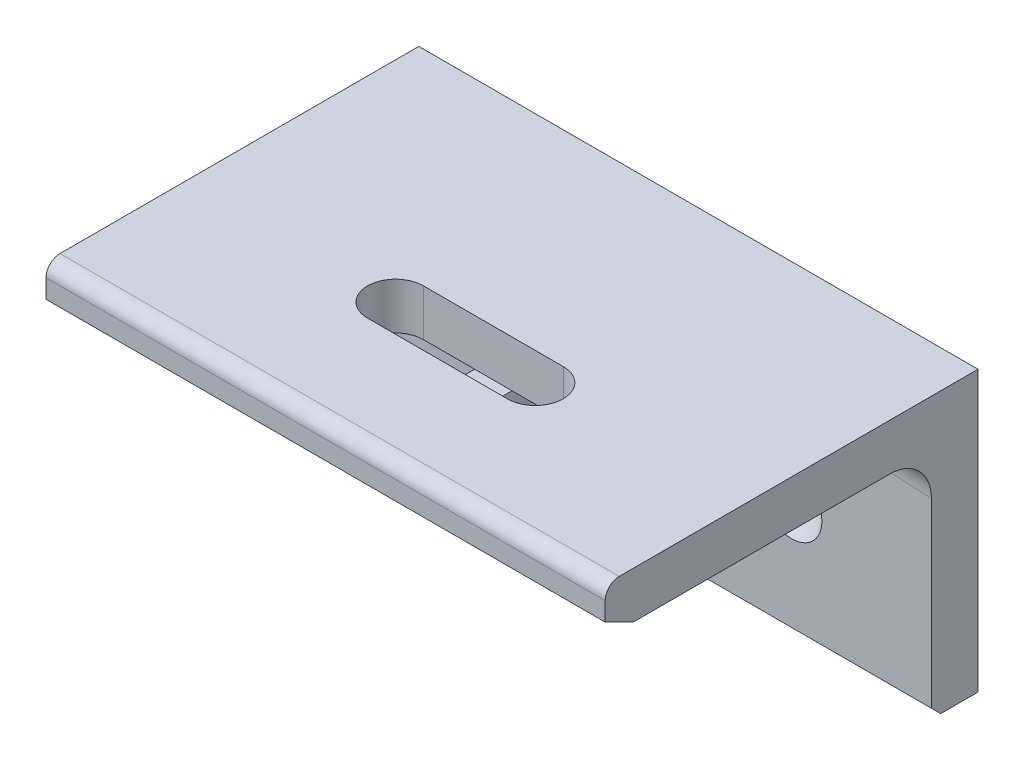
ISO-10303-21;
HEADER;
FILE_DESCRIPTION(('STEP AP214'),'2;1');
FILE_NAME('part.step','',(''),(''),'','','');
FILE_SCHEMA(('AUTOMOTIVE_DESIGN { 1 0 10303 214 1 1 1 1 }'));
ENDSEC;
DATA;
#1=APPLICATION_CONTEXT('core data for automotive mechanical design processes');
#2=APPLICATION_PROTOCOL_DEFINITION('international standard','automotive_design',2000,#1);
#3=PRODUCT_CONTEXT('',#1,'mechanical');
#4=PRODUCT('Part','Part','',(#3));
#5=PRODUCT_RELATED_PRODUCT_CATEGORY('part','',(#4));
#6=PRODUCT_DEFINITION_FORMATION('','',#4);
#7=PRODUCT_DEFINITION_CONTEXT('part definition',#1,'design');
#8=PRODUCT_DEFINITION('design','',#6,#7);
#9=PRODUCT_DEFINITION_SHAPE('','',#8);
#10=(LENGTH_UNIT() NAMED_UNIT(*) SI_UNIT(.MILLI.,.METRE.));
#11=(NAMED_UNIT(*) PLANE_ANGLE_UNIT() SI_UNIT($,.RADIAN.));
#12=(NAMED_UNIT(*) SI_UNIT($,.STERADIAN.) SOLID_ANGLE_UNIT());
#13=UNCERTAINTY_MEASURE_WITH_UNIT(LENGTH_MEASURE(1.E-05),#10,'distance_accuracy_value','');
#14=(GEOMETRIC_REPRESENTATION_CONTEXT(3) GLOBAL_UNCERTAINTY_ASSIGNED_CONTEXT((#13)) GLOBAL_UNIT_ASSIGNED_CONTEXT((#10,
#11,#12)) REPRESENTATION_CONTEXT('',''));
#15=CARTESIAN_POINT('',(0.,0.,0.));
#16=DIRECTION('',(0.,0.,1.));
#17=DIRECTION('',(1.,0.,0.));
#18=AXIS2_PLACEMENT_3D('',#15,#16,#17);
#19=CARTESIAN_POINT('',(120.,50.,10.));
#20=DIRECTION('',(0.,1.,0.));
#21=DIRECTION('',(0.,0.,1.));
#22=AXIS2_PLACEMENT_3D('',#19,#20,#21);
#23=PLANE('',#22);
#24=DIRECTION('',(1.,0.,0.));
#25=VECTOR('',#24,1.);
#26=CARTESIAN_POINT('',(75.,50.,56.));
#27=LINE('',#26,#25);
#28=CARTESIAN_POINT('',(45.,50.,56.));
#29=VERTEX_POINT('',#28);
#30=CARTESIAN_POINT('',(56.,50.,56.));
#31=VERTEX_POINT('',#30);
#32=EDGE_CURVE('E228',#29,#31,#27,.T.);
#33=ORIENTED_EDGE('',*,*,#32,.T.);
#34=DIRECTION('',(0.,0.,1.));
#35=VECTOR('',#34,1.);
#36=CARTESIAN_POINT('',(56.,50.,60.));
#37=LINE('',#36,#35);
#38=CARTESIAN_POINT('',(56.,50.,60.));
#39=VERTEX_POINT('',#38);
#40=EDGE_CURVE('E310',#31,#39,#37,.T.);
#41=ORIENTED_EDGE('',*,*,#40,.T.);
#42=DIRECTION('',(-1.,0.,0.));
#43=VECTOR('',#42,1.);
#44=CARTESIAN_POINT('',(64.,50.,60.));
#45=LINE('',#44,#43);
#46=CARTESIAN_POINT('',(64.,50.,60.));
#47=VERTEX_POINT('',#46);
#48=EDGE_CURVE('E340',#47,#39,#45,.T.);
#49=ORIENTED_EDGE('',*,*,#48,.F.);
#50=DIRECTION('',(0.,0.,1.));
#51=VECTOR('',#50,1.);
#52=CARTESIAN_POINT('',(64.,50.,60.));
#53=LINE('',#52,#51);
#54=CARTESIAN_POINT('',(64.,50.,56.));
#55=VERTEX_POINT('',#54);
#56=EDGE_CURVE('E316',#55,#47,#53,.T.);
#57=ORIENTED_EDGE('',*,*,#56,.F.);
#58=CARTESIAN_POINT('',(75.,50.,56.));
#59=VERTEX_POINT('',#58);
#60=EDGE_CURVE('E249',#55,#59,#27,.T.);
#61=ORIENTED_EDGE('',*,*,#60,.T.);
#62=CARTESIAN_POINT('',(75.,50.,50.));
#63=DIRECTION('',(0.,1.,0.));
#64=DIRECTION('',(0.,0.,-1.));
#65=AXIS2_PLACEMENT_3D('',#62,#63,#64);
#66=CIRCLE('',#65,6.);
#67=CARTESIAN_POINT('',(75.,50.,44.));
#68=VERTEX_POINT('',#67);
#69=EDGE_CURVE('E252',#59,#68,#66,.T.);
#70=ORIENTED_EDGE('',*,*,#69,.T.);
#71=DIRECTION('',(-1.,0.,0.));
#72=VECTOR('',#71,1.);
#73=CARTESIAN_POINT('',(45.,50.,44.));
#74=LINE('',#73,#72);
#75=CARTESIAN_POINT('',(64.,50.,44.));
#76=VERTEX_POINT('',#75);
#77=EDGE_CURVE('E222',#68,#76,#74,.T.);
#78=ORIENTED_EDGE('',*,*,#77,.T.);
#79=CARTESIAN_POINT('',(64.,50.,16.2));
#80=VERTEX_POINT('',#79);
#81=EDGE_CURVE('E311',#80,#76,#53,.T.);
#82=ORIENTED_EDGE('',*,*,#81,.F.);
#83=DIRECTION('',(0.998752338877845,0.,0.0499376169438924));
#84=VECTOR('',#83,1.);
#85=CARTESIAN_POINT('',(59.9999999512245,50.,15.9999999975612));
#86=LINE('',#85,#84);
#87=CARTESIAN_POINT('',(120.,50.,19.));
#88=VERTEX_POINT('',#87);
#89=EDGE_CURVE('E350',#80,#88,#86,.T.);
#90=ORIENTED_EDGE('',*,*,#89,.T.);
#91=DIRECTION('',(0.,0.,-1.));
#92=VECTOR('',#91,1.);
#93=CARTESIAN_POINT('',(120.,50.,10.));
#94=LINE('',#93,#92);
#95=CARTESIAN_POINT('',(120.,50.,74.));
#96=VERTEX_POINT('',#95);
#97=EDGE_CURVE('E489',#96,#88,#94,.T.);
#98=ORIENTED_EDGE('',*,*,#97,.F.);
#99=DIRECTION('',(-1.,0.,0.));
#100=VECTOR('',#99,1.);
#101=CARTESIAN_POINT('',(120.,50.,74.));
#102=LINE('',#101,#100);
#103=CARTESIAN_POINT('',(0.,50.,74.));
#104=VERTEX_POINT('',#103);
#105=EDGE_CURVE('E306',#96,#104,#102,.T.);
#106=ORIENTED_EDGE('',*,*,#105,.T.);
#107=DIRECTION('',(0.,0.,-1.));
#108=VECTOR('',#107,1.);
#109=CARTESIAN_POINT('',(0.,50.,10.));
#110=LINE('',#109,#108);
#111=CARTESIAN_POINT('',(0.,50.,13.));
#112=VERTEX_POINT('',#111);
#113=EDGE_CURVE('E509',#104,#112,#110,.T.);
#114=ORIENTED_EDGE('',*,*,#113,.T.);
#115=CARTESIAN_POINT('',(56.,50.,15.8));
#116=VERTEX_POINT('',#115);
#117=EDGE_CURVE('E345',#112,#116,#86,.T.);
#118=ORIENTED_EDGE('',*,*,#117,.T.);
#119=CARTESIAN_POINT('',(56.,50.,44.));
#120=VERTEX_POINT('',#119);
#121=EDGE_CURVE('E325',#116,#120,#37,.T.);
#122=ORIENTED_EDGE('',*,*,#121,.T.);
#123=CARTESIAN_POINT('',(45.,50.,44.));
#124=VERTEX_POINT('',#123);
#125=EDGE_CURVE('E256',#120,#124,#74,.T.);
#126=ORIENTED_EDGE('',*,*,#125,.T.);
#127=CARTESIAN_POINT('',(45.,50.,50.));
#128=DIRECTION('',(0.,1.,0.));
#129=DIRECTION('',(0.,0.,-1.));
#130=AXIS2_PLACEMENT_3D('',#127,#128,#129);
#131=CIRCLE('',#130,6.);
#132=EDGE_CURVE('E246',#124,#29,#131,.T.);
#133=ORIENTED_EDGE('',*,*,#132,.T.);
#134=EDGE_LOOP('',(#33,#41,#49,#57,#61,#70,#78,#82,#90,#98,#106,#114,#118,#122,#126,#133));
#135=FACE_BOUND('',#134,.T.);
#136=ADVANCED_FACE('F71',(#135),#23,.F.);
#137=CARTESIAN_POINT('',(120.,60.,80.));
#138=DIRECTION('',(0.,-1.,0.));
#139=DIRECTION('',(0.,0.,-1.));
#140=AXIS2_PLACEMENT_3D('',#137,#138,#139);
#141=PLANE('',#140);
#142=DIRECTION('',(0.,0.,1.));
#143=VECTOR('',#142,1.);
#144=CARTESIAN_POINT('',(0.,60.,80.));
#145=LINE('',#144,#143);
#146=CARTESIAN_POINT('',(0.,60.,0.));
#147=VERTEX_POINT('',#146);
#148=CARTESIAN_POINT('',(0.,60.,77.));
#149=VERTEX_POINT('',#148);
#150=EDGE_CURVE('E533',#147,#149,#145,.T.);
#151=ORIENTED_EDGE('',*,*,#150,.T.);
#152=DIRECTION('',(-1.,0.,0.));
#153=VECTOR('',#152,1.);
#154=CARTESIAN_POINT('',(120.,60.,77.));
#155=LINE('',#154,#153);
#156=CARTESIAN_POINT('',(120.,60.,77.));
#157=VERTEX_POINT('',#156);
#158=EDGE_CURVE('E452',#149,#157,#155,.F.);
#159=ORIENTED_EDGE('',*,*,#158,.T.);
#160=DIRECTION('',(0.,0.,1.));
#161=VECTOR('',#160,1.);
#162=CARTESIAN_POINT('',(120.,60.,80.));
#163=LINE('',#162,#161);
#164=CARTESIAN_POINT('',(120.,60.,0.));
#165=VERTEX_POINT('',#164);
#166=EDGE_CURVE('E506',#165,#157,#163,.T.);
#167=ORIENTED_EDGE('',*,*,#166,.F.);
#168=DIRECTION('',(-1.,0.,0.));
#169=VECTOR('',#168,1.);
#170=CARTESIAN_POINT('',(120.,60.,0.));
#171=LINE('',#170,#169);
#172=EDGE_CURVE('E375',#165,#147,#171,.T.);
#173=ORIENTED_EDGE('',*,*,#172,.T.);
#174=EDGE_LOOP('',(#151,#159,#167,#173));
#175=FACE_BOUND('',#174,.T.);
#176=CARTESIAN_POINT('',(45.,60.,50.));
#177=DIRECTION('',(0.,1.,0.));
#178=DIRECTION('',(0.,0.,-1.));
#179=AXIS2_PLACEMENT_3D('',#176,#177,#178);
#180=CIRCLE('',#179,6.);
#181=CARTESIAN_POINT('',(45.,60.,44.));
#182=VERTEX_POINT('',#181);
#183=CARTESIAN_POINT('',(45.,60.,56.));
#184=VERTEX_POINT('',#183);
#185=EDGE_CURVE('E210',#182,#184,#180,.T.);
#186=ORIENTED_EDGE('',*,*,#185,.F.);
#187=DIRECTION('',(-1.,0.,0.));
#188=VECTOR('',#187,1.);
#189=CARTESIAN_POINT('',(45.,60.,44.));
#190=LINE('',#189,#188);
#191=CARTESIAN_POINT('',(75.,60.,44.));
#192=VERTEX_POINT('',#191);
#193=EDGE_CURVE('E241',#192,#182,#190,.T.);
#194=ORIENTED_EDGE('',*,*,#193,.F.);
#195=CARTESIAN_POINT('',(75.,60.,50.));
#196=DIRECTION('',(0.,1.,0.));
#197=DIRECTION('',(0.,0.,-1.));
#198=AXIS2_PLACEMENT_3D('',#195,#196,#197);
#199=CIRCLE('',#198,6.);
#200=CARTESIAN_POINT('',(75.,60.,56.));
#201=VERTEX_POINT('',#200);
#202=EDGE_CURVE('E235',#201,#192,#199,.T.);
#203=ORIENTED_EDGE('',*,*,#202,.F.);
#204=DIRECTION('',(1.,0.,0.));
#205=VECTOR('',#204,1.);
#206=CARTESIAN_POINT('',(75.,60.,56.));
#207=LINE('',#206,#205);
#208=EDGE_CURVE('E221',#184,#201,#207,.T.);
#209=ORIENTED_EDGE('',*,*,#208,.F.);
#210=EDGE_LOOP('',(#186,#194,#203,#209));
#211=FACE_BOUND('',#210,.T.);
#212=ADVANCED_FACE('F234',(#175,#211),#141,.F.);
#213=CARTESIAN_POINT('',(120.,50.,80.));
#214=DIRECTION('',(0.,0.,-1.));
#215=DIRECTION('',(-1.,0.,0.));
#216=AXIS2_PLACEMENT_3D('',#213,#214,#215);
#217=PLANE('',#216);
#218=DIRECTION('',(0.,-1.,0.));
#219=VECTOR('',#218,1.);
#220=CARTESIAN_POINT('',(120.,50.,80.));
#221=LINE('',#220,#219);
#222=CARTESIAN_POINT('',(120.,57.,80.));
#223=VERTEX_POINT('',#222);
#224=CARTESIAN_POINT('',(120.,53.,80.));
#225=VERTEX_POINT('',#224);
#226=EDGE_CURVE('E543',#223,#225,#221,.T.);
#227=ORIENTED_EDGE('',*,*,#226,.F.);
#228=DIRECTION('',(-1.,0.,0.));
#229=VECTOR('',#228,1.);
#230=CARTESIAN_POINT('',(120.,57.,80.));
#231=LINE('',#230,#229);
#232=CARTESIAN_POINT('',(0.,57.,80.));
#233=VERTEX_POINT('',#232);
#234=EDGE_CURVE('E454',#223,#233,#231,.T.);
#235=ORIENTED_EDGE('',*,*,#234,.T.);
#236=DIRECTION('',(0.,-1.,0.));
#237=VECTOR('',#236,1.);
#238=CARTESIAN_POINT('',(0.,50.,80.));
#239=LINE('',#238,#237);
#240=CARTESIAN_POINT('',(0.,53.,80.));
#241=VERTEX_POINT('',#240);
#242=EDGE_CURVE('E537',#233,#241,#239,.T.);
#243=ORIENTED_EDGE('',*,*,#242,.T.);
#244=DIRECTION('',(-1.,0.,0.));
#245=VECTOR('',#244,1.);
#246=CARTESIAN_POINT('',(120.,53.,80.));
#247=LINE('',#246,#245);
#248=EDGE_CURVE('E299',#225,#241,#247,.T.);
#249=ORIENTED_EDGE('',*,*,#248,.F.);
#250=EDGE_LOOP('',(#227,#235,#243,#249));
#251=FACE_BOUND('',#250,.T.);
#252=ADVANCED_FACE('F417',(#251),#217,.F.);
#253=CARTESIAN_POINT('',(120.,0.,0.));
#254=DIRECTION('',(-1.,0.,0.));
#255=DIRECTION('',(0.,0.,1.));
#256=AXIS2_PLACEMENT_3D('',#253,#254,#255);
#257=PLANE('',#256);
#258=DIRECTION('',(0.,-1.,0.));
#259=VECTOR('',#258,1.);
#260=CARTESIAN_POINT('',(120.,0.,10.));
#261=LINE('',#260,#259);
#262=CARTESIAN_POINT('',(120.,41.,10.));
#263=VERTEX_POINT('',#262);
#264=CARTESIAN_POINT('',(120.,1.99999999999999,10.));
#265=VERTEX_POINT('',#264);
#266=EDGE_CURVE('E478',#263,#265,#261,.T.);
#267=ORIENTED_EDGE('',*,*,#266,.T.);
#268=DIRECTION('',(0.,0.707106781186548,0.707106781186548));
#269=VECTOR('',#268,1.);
#270=CARTESIAN_POINT('',(120.,0.,8.00000000000001));
#271=LINE('',#270,#269);
#272=CARTESIAN_POINT('',(120.,0.,8.00000000000001));
#273=VERTEX_POINT('',#272);
#274=EDGE_CURVE('E12',#265,#273,#271,.F.);
#275=ORIENTED_EDGE('',*,*,#274,.T.);
#276=DIRECTION('',(0.,0.,-1.));
#277=VECTOR('',#276,1.);
#278=CARTESIAN_POINT('',(120.,0.,0.));
#279=LINE('',#278,#277);
#280=CARTESIAN_POINT('',(120.,0.,0.));
#281=VERTEX_POINT('',#280);
#282=EDGE_CURVE('E488',#273,#281,#279,.T.);
#283=ORIENTED_EDGE('',*,*,#282,.T.);
#284=DIRECTION('',(0.,1.,0.));
#285=VECTOR('',#284,1.);
#286=CARTESIAN_POINT('',(120.,60.,0.));
#287=LINE('',#286,#285);
#288=EDGE_CURVE('E503',#281,#165,#287,.T.);
#289=ORIENTED_EDGE('',*,*,#288,.T.);
#290=ORIENTED_EDGE('',*,*,#166,.T.);
#291=CARTESIAN_POINT('',(120.,57.,77.));
#292=DIRECTION('',(-1.,0.,0.));
#293=DIRECTION('',(0.,0.,1.));
#294=AXIS2_PLACEMENT_3D('',#291,#292,#293);
#295=CIRCLE('',#294,3.);
#296=EDGE_CURVE('E451',#157,#223,#295,.F.);
#297=ORIENTED_EDGE('',*,*,#296,.T.);
#298=ORIENTED_EDGE('',*,*,#226,.T.);
#299=DIRECTION('',(0.,0.447213595499957,0.894427190999916));
#300=VECTOR('',#299,1.);
#301=CARTESIAN_POINT('',(120.,53.,80.));
#302=LINE('',#301,#300);
#303=EDGE_CURVE('E295',#96,#225,#302,.T.);
#304=ORIENTED_EDGE('',*,*,#303,.F.);
#305=ORIENTED_EDGE('',*,*,#97,.T.);
#306=CARTESIAN_POINT('',(120.,41.0004744407489,18.9995255592511));
#307=DIRECTION('',(-1.,0.,0.));
#308=DIRECTION('',(0.,0.,1.));
#309=AXIS2_PLACEMENT_3D('',#306,#307,#308);
#310=CIRCLE('',#309,8.999525571757);
#311=EDGE_CURVE('E349',#88,#263,#310,.T.);
#312=ORIENTED_EDGE('',*,*,#311,.T.);
#313=EDGE_LOOP('',(#267,#275,#283,#289,#290,#297,#298,#304,#305,#312));
#314=FACE_BOUND('',#313,.T.);
#315=ADVANCED_FACE('F431',(#314),#257,.F.);
#316=CARTESIAN_POINT('',(0.,0.,0.));
#317=DIRECTION('',(-1.,0.,0.));
#318=DIRECTION('',(0.,0.,1.));
#319=AXIS2_PLACEMENT_3D('',#316,#317,#318);
#320=PLANE('',#319);
#321=DIRECTION('',(0.,0.,-1.));
#322=VECTOR('',#321,1.);
#323=CARTESIAN_POINT('',(0.,0.,0.));
#324=LINE('',#323,#322);
#325=CARTESIAN_POINT('',(0.,0.,8.00000000000001));
#326=VERTEX_POINT('',#325);
#327=CARTESIAN_POINT('',(0.,0.,0.));
#328=VERTEX_POINT('',#327);
#329=EDGE_CURVE('E495',#326,#328,#324,.T.);
#330=ORIENTED_EDGE('',*,*,#329,.F.);
#331=DIRECTION('',(0.,-0.707106781186548,-0.707106781186548));
#332=VECTOR('',#331,1.);
#333=CARTESIAN_POINT('',(0.,-4.00000000000001,4.00000000000001));
#334=LINE('',#333,#332);
#335=CARTESIAN_POINT('',(0.,1.99999999999999,10.));
#336=VERTEX_POINT('',#335);
#337=EDGE_CURVE('E463',#326,#336,#334,.F.);
#338=ORIENTED_EDGE('',*,*,#337,.T.);
#339=DIRECTION('',(0.,-1.,0.));
#340=VECTOR('',#339,1.);
#341=CARTESIAN_POINT('',(0.,0.,10.));
#342=LINE('',#341,#340);
#343=CARTESIAN_POINT('',(0.,47.,10.));
#344=VERTEX_POINT('',#343);
#345=EDGE_CURVE('E481',#344,#336,#342,.T.);
#346=ORIENTED_EDGE('',*,*,#345,.F.);
#347=CARTESIAN_POINT('',(0.,47.0000329687124,12.9999670312876));
#348=DIRECTION('',(-1.,0.,0.));
#349=DIRECTION('',(0.,0.,1.));
#350=AXIS2_PLACEMENT_3D('',#347,#348,#349);
#351=CIRCLE('',#350,2.99996703146878);
#352=EDGE_CURVE('E344',#112,#344,#351,.T.);
#353=ORIENTED_EDGE('',*,*,#352,.F.);
#354=ORIENTED_EDGE('',*,*,#113,.F.);
#355=DIRECTION('',(0.,0.447213595499957,0.894427190999916));
#356=VECTOR('',#355,1.);
#357=CARTESIAN_POINT('',(0.,53.,80.));
#358=LINE('',#357,#356);
#359=EDGE_CURVE('E291',#104,#241,#358,.T.);
#360=ORIENTED_EDGE('',*,*,#359,.T.);
#361=ORIENTED_EDGE('',*,*,#242,.F.);
#362=CARTESIAN_POINT('',(0.,57.,77.));
#363=DIRECTION('',(-1.,0.,0.));
#364=DIRECTION('',(0.,0.,1.));
#365=AXIS2_PLACEMENT_3D('',#362,#363,#364);
#366=CIRCLE('',#365,3.);
#367=EDGE_CURVE('E466',#233,#149,#366,.T.);
#368=ORIENTED_EDGE('',*,*,#367,.T.);
#369=ORIENTED_EDGE('',*,*,#150,.F.);
#370=DIRECTION('',(0.,1.,0.));
#371=VECTOR('',#370,1.);
#372=CARTESIAN_POINT('',(0.,60.,0.));
#373=LINE('',#372,#371);
#374=EDGE_CURVE('E501',#328,#147,#373,.T.);
#375=ORIENTED_EDGE('',*,*,#374,.F.);
#376=EDGE_LOOP('',(#330,#338,#346,#353,#354,#360,#361,#368,#369,#375));
#377=FACE_BOUND('',#376,.T.);
#378=ADVANCED_FACE('F499',(#377),#320,.T.);
#379=CARTESIAN_POINT('',(120.,0.,10.));
#380=DIRECTION('',(0.,0.,-1.));
#381=DIRECTION('',(-1.,0.,0.));
#382=AXIS2_PLACEMENT_3D('',#379,#380,#381);
#383=PLANE('',#382);
#384=CARTESIAN_POINT('',(30.,25.,10.));
#385=DIRECTION('',(0.,0.,1.));
#386=DIRECTION('',(1.,0.,0.));
#387=AXIS2_PLACEMENT_3D('',#384,#385,#386);
#388=CIRCLE('',#387,6.5);
#389=CARTESIAN_POINT('',(36.5,25.,10.));
#390=VERTEX_POINT('',#389);
#391=EDGE_CURVE('E287',#390,#390,#388,.T.);
#392=ORIENTED_EDGE('',*,*,#391,.F.);
#393=EDGE_LOOP('',(#392));
#394=FACE_BOUND('',#393,.T.);
#395=CARTESIAN_POINT('',(90.,25.,10.));
#396=DIRECTION('',(0.,0.,1.));
#397=DIRECTION('',(1.,0.,0.));
#398=AXIS2_PLACEMENT_3D('',#395,#396,#397);
#399=CIRCLE('',#398,6.50000000000001);
#400=CARTESIAN_POINT('',(96.5,25.,10.));
#401=VERTEX_POINT('',#400);
#402=EDGE_CURVE('E286',#401,#401,#399,.T.);
#403=ORIENTED_EDGE('',*,*,#402,.F.);
#404=EDGE_LOOP('',(#403));
#405=FACE_BOUND('',#404,.T.);
#406=ORIENTED_EDGE('',*,*,#345,.T.);
#407=DIRECTION('',(1.,0.,0.));
#408=VECTOR('',#407,1.);
#409=CARTESIAN_POINT('',(120.,1.99999999999999,10.));
#410=LINE('',#409,#408);
#411=EDGE_CURVE('E81',#336,#265,#410,.T.);
#412=ORIENTED_EDGE('',*,*,#411,.T.);
#413=ORIENTED_EDGE('',*,*,#266,.F.);
#414=DIRECTION('',(-0.998752338877845,0.0499376169438932,0.));
#415=VECTOR('',#414,1.);
#416=CARTESIAN_POINT('',(59.9999999512245,44.0000000024388,10.));
#417=LINE('',#416,#415);
#418=CARTESIAN_POINT('',(64.,43.8,10.));
#419=VERTEX_POINT('',#418);
#420=EDGE_CURVE('E361',#263,#419,#417,.T.);
#421=ORIENTED_EDGE('',*,*,#420,.T.);
#422=DIRECTION('',(0.,1.,0.));
#423=VECTOR('',#422,1.);
#424=CARTESIAN_POINT('',(64.,50.,10.));
#425=LINE('',#424,#423);
#426=CARTESIAN_POINT('',(64.,10.,10.));
#427=VERTEX_POINT('',#426);
#428=EDGE_CURVE('E320',#427,#419,#425,.T.);
#429=ORIENTED_EDGE('',*,*,#428,.F.);
#430=DIRECTION('',(-1.,0.,0.));
#431=VECTOR('',#430,1.);
#432=CARTESIAN_POINT('',(64.,10.,10.));
#433=LINE('',#432,#431);
#434=CARTESIAN_POINT('',(56.,10.,10.));
#435=VERTEX_POINT('',#434);
#436=EDGE_CURVE('E324',#427,#435,#433,.T.);
#437=ORIENTED_EDGE('',*,*,#436,.T.);
#438=DIRECTION('',(0.,1.,0.));
#439=VECTOR('',#438,1.);
#440=CARTESIAN_POINT('',(56.,50.,10.));
#441=LINE('',#440,#439);
#442=CARTESIAN_POINT('',(56.,44.2,10.));
#443=VERTEX_POINT('',#442);
#444=EDGE_CURVE('E334',#435,#443,#441,.T.);
#445=ORIENTED_EDGE('',*,*,#444,.T.);
#446=EDGE_CURVE('E362',#443,#344,#417,.T.);
#447=ORIENTED_EDGE('',*,*,#446,.T.);
#448=EDGE_LOOP('',(#406,#412,#413,#421,#429,#437,#445,#447));
#449=FACE_BOUND('',#448,.T.);
#450=ADVANCED_FACE('F426',(#394,#405,#449),#383,.F.);
#451=CARTESIAN_POINT('',(0.,50.,13.));
#452=CARTESIAN_POINT('',(6.66666665893338,50.,13.3333333329467));
#453=CARTESIAN_POINT('',(19.999999944283,50.,13.9999999972141));
#454=CARTESIAN_POINT('',(39.999999987119,50.,14.9999999993559));
#455=CARTESIAN_POINT('',(60.0000000340792,50.,16.000000001704));
#456=CARTESIAN_POINT('',(79.9999999659832,50.,16.9999999982992));
#457=CARTESIAN_POINT('',(100.00000000444,50.,18.000000000222));
#458=CARTESIAN_POINT('',(113.333333334813,50.,18.6666666667407));
#459=CARTESIAN_POINT('',(120.,50.,19.));
#460=CARTESIAN_POINT('',(0.,50.0000087437242,12.2043703761638));
#461=CARTESIAN_POINT('',(6.66666665893338,50.0000082796338,12.4493008563521));
#462=CARTESIAN_POINT('',(19.999999944283,50.000007351453,12.9391618155339));
#463=CARTESIAN_POINT('',(39.999999987119,50.0000318002566,13.6739453623499));
#464=CARTESIAN_POINT('',(60.0000000340792,50.0000615427566,14.4087272920665));
#465=CARTESIAN_POINT('',(79.9999999659832,50.0000714341979,15.1435152831035));
#466=CARTESIAN_POINT('',(100.00000000444,50.000101107074,15.8782972338781));
#467=CARTESIAN_POINT('',(113.333333334813,50.0001175920975,16.3681528740891));
#468=CARTESIAN_POINT('',(120.,50.0001258346093,16.6130806941946));
#469=CARTESIAN_POINT('',(0.,49.6839251023615,11.4412651023614));
#470=CARTESIAN_POINT('',(6.66666665893338,49.6488037736568,11.6014069443703));
#471=CARTESIAN_POINT('',(19.999999944283,49.5785611164188,11.9216906276069));
#472=CARTESIAN_POINT('',(39.999999987119,49.4732312520963,12.4020932004398));
#473=CARTESIAN_POINT('',(60.0000000340792,49.3679083778888,12.882491071184));
#474=CARTESIAN_POINT('',(79.9999999659832,49.2625592917194,13.3629065727791));
#475=CARTESIAN_POINT('',(100.00000000444,49.1572363256254,13.8433045052348));
#476=CARTESIAN_POINT('',(113.333333334813,49.0870166616255,14.1635727214953));
#477=CARTESIAN_POINT('',(120.,49.0519068296255,14.3237068296255));
#478=CARTESIAN_POINT('',(0.,48.5587348976386,10.3160748976385));
#479=CARTESIAN_POINT('',(6.66666665893338,48.3985930556297,10.3511962263432));
#480=CARTESIAN_POINT('',(19.999999944283,48.0783093723931,10.4214388835812));
#481=CARTESIAN_POINT('',(39.999999987119,47.5979067995601,10.5267687479036));
#482=CARTESIAN_POINT('',(60.0000000340792,47.117508928816,10.6320916221112));
#483=CARTESIAN_POINT('',(79.9999999659832,46.6370934272209,10.7374407082806));
#484=CARTESIAN_POINT('',(100.00000000444,46.1566954947652,10.8427636743746));
#485=CARTESIAN_POINT('',(113.333333334813,45.8364272785047,10.9129833383745));
#486=CARTESIAN_POINT('',(120.,45.6762931703745,10.9480931703745));
#487=CARTESIAN_POINT('',(0.,47.7956296238362,9.99999125627584));
#488=CARTESIAN_POINT('',(6.66666665893338,47.5506991436479,9.99999172036621));
#489=CARTESIAN_POINT('',(19.999999944283,47.0608381844661,9.99999264854696));
#490=CARTESIAN_POINT('',(39.999999987119,46.3260546376501,9.99996819974344));
#491=CARTESIAN_POINT('',(60.0000000340792,45.5912727079336,9.9999384572434));
#492=CARTESIAN_POINT('',(79.9999999659832,44.8564847168965,9.99992856580213));
#493=CARTESIAN_POINT('',(100.00000000444,44.1217027661219,9.99989889292601));
#494=CARTESIAN_POINT('',(113.333333334813,43.6318471259109,9.99988240790244));
#495=CARTESIAN_POINT('',(120.,43.3869193058054,9.99987416539066));
#496=CARTESIAN_POINT('',(0.,47.,10.));
#497=CARTESIAN_POINT('',(6.66666665893338,46.6666666670533,10.));
#498=CARTESIAN_POINT('',(19.999999944283,46.0000000027858,9.99999999999999));
#499=CARTESIAN_POINT('',(39.999999987119,45.000000000644,10.));
#500=CARTESIAN_POINT('',(60.0000000340792,43.999999998296,9.99999999999999));
#501=CARTESIAN_POINT('',(79.9999999659832,43.0000000017008,10.));
#502=CARTESIAN_POINT('',(100.00000000444,41.999999999778,10.));
#503=CARTESIAN_POINT('',(113.333333334813,41.3333333332593,10.));
#504=CARTESIAN_POINT('',(120.,41.,10.));
#505=B_SPLINE_SURFACE_WITH_KNOTS('',3,3,((#451,#452,#453,#454,#455,#456,#457,#458,#459),(#460,
#461,#462,#463,#464,#465,#466,#467,#468),(#469,#470,#471,#472,#473,#474,#475,#476,#477),(#478,
#479,#480,#481,#482,#483,#484,#485,#486),(#487,#488,#489,#490,#491,#492,#493,#494,#495),(#496,
#497,#498,#499,#500,#501,#502,#503,#504)),.UNSPECIFIED.,.F.,.F.,.F.,(4,2,4),(4,1,1,1,1,1,4),(0.,
0.5,1.),(0.,0.166666667411848,0.333333334010767,0.500000000406463,0.666666667208609,
0.833333333604305,1.),.UNSPECIFIED.);
#506=CARTESIAN_POINT('',(64.,50.,16.2));
#507=CARTESIAN_POINT('',(64.,50.0000291941018,16.0256494214508));
#508=CARTESIAN_POINT('',(64.,49.9926688098755,15.8513004183381));
#509=CARTESIAN_POINT('',(64.,49.9632981309546,15.5038502225449));
#510=CARTESIAN_POINT('',(64.,49.9412886531091,15.3307489608329));
#511=CARTESIAN_POINT('',(64.,49.882770835598,14.9871473574418));
#512=CARTESIAN_POINT('',(64.,49.8462733206599,14.8166451724019));
#513=CARTESIAN_POINT('',(64.,49.7590528574362,14.4793211592619));
#514=CARTESIAN_POINT('',(64.,49.7083300409973,14.3124992970664));
#515=CARTESIAN_POINT('',(64.,49.5929922711815,13.9836285741696));
#516=CARTESIAN_POINT('',(64.,49.5283698806338,13.8215823217134));
#517=CARTESIAN_POINT('',(64.,49.3857080392582,13.5035035002834));
#518=CARTESIAN_POINT('',(64.,49.3076683088831,13.347471056689));
#519=CARTESIAN_POINT('',(64.,49.1387379869686,13.0425626862907));
#520=CARTESIAN_POINT('',(64.,49.0478497742923,12.8936854415423));
#521=CARTESIAN_POINT('',(64.,48.8538523660735,12.6041194752169));
#522=CARTESIAN_POINT('',(64.,48.7507432470306,12.4634307023905));
#523=CARTESIAN_POINT('',(64.,48.5330261226605,12.191234618841));
#524=CARTESIAN_POINT('',(64.,48.4184172701655,12.0597279857642));
#525=CARTESIAN_POINT('',(64.,48.1785385587142,11.8068267517576));
#526=CARTESIAN_POINT('',(64.,48.0532686798609,11.6854321697011));
#527=CARTESIAN_POINT('',(64.,47.7929223074323,11.4536002078913));
#528=CARTESIAN_POINT('',(64.,47.6578437737932,11.3431651189291));
#529=CARTESIAN_POINT('',(64.,47.3788597642376,11.1340784161157));
#530=CARTESIAN_POINT('',(64.,47.2349544572897,11.0354265768074));
#531=CARTESIAN_POINT('',(64.,46.9393170494396,10.8505849657236));
#532=CARTESIAN_POINT('',(64.,46.7875836240832,10.7643973122307));
#533=CARTESIAN_POINT('',(64.,46.4773997801001,10.6051123305294));
#534=CARTESIAN_POINT('',(64.,46.3189494680978,10.5320147946236));
#535=CARTESIAN_POINT('',(64.,45.9965227722406,10.399454846955));
#536=CARTESIAN_POINT('',(64.,45.8325489588946,10.3399861904928));
#537=CARTESIAN_POINT('',(64.,45.500241072895,10.2350816564469));
#538=CARTESIAN_POINT('',(64.,45.3319080718872,10.1896423647759));
#539=CARTESIAN_POINT('',(64.,44.9385078950631,10.1010727836537));
#540=CARTESIAN_POINT('',(64.,44.7122332632277,10.0631540202837));
#541=CARTESIAN_POINT('',(64.,44.3710015097759,10.0252516169244));
#542=CARTESIAN_POINT('',(64.,44.2570119265045,10.0157801074057));
#543=CARTESIAN_POINT('',(64.,44.02869078111,10.0031525249842));
#544=CARTESIAN_POINT('',(64.,43.914359241537,9.99999604445092));
#545=CARTESIAN_POINT('',(64.,43.8,10.));
#546=B_SPLINE_CURVE_WITH_KNOTS('',3,(#506,#507,#508,#509,#510,#511,#512,#513,#514,#515,#516,
#517,#518,#519,#520,#521,#522,#523,#524,#525,#526,#527,#528,#529,#530,#531,#532,#533,#534,#535,
#536,#537,#538,#539,#540,#541,#542,#543,#544,#545),.UNSPECIFIED.,.F.,.F.,(4,2,2,2,2,2,2,2,2,2,2,
2,2,2,2,2,2,2,2,4),(0.,0.522893250993043,1.04575734734072,1.56823151918997,2.09070084866226,
2.613450431547,3.13621090712195,3.65887472141121,4.18153526414038,4.70423433878421,
5.22693438897799,5.7497434666313,6.27254253940897,6.79543035750066,7.31830987833656,
7.84094933667275,8.36346150872354,9.05015032669387,9.39315079291767,9.73612911800133),.UNSPECIFIED.);
#547=EDGE_CURVE('E374',#80,#419,#546,.T.);
#548=ORIENTED_EDGE('',*,*,#547,.T.);
#549=ORIENTED_EDGE('',*,*,#420,.F.);
#550=ORIENTED_EDGE('',*,*,#311,.F.);
#551=ORIENTED_EDGE('',*,*,#89,.F.);
#552=EDGE_LOOP('',(#548,#549,#550,#551));
#553=FACE_BOUND('',#552,.T.);
#554=ADVANCED_FACE('F411',(#553),#505,.T.);
#555=CARTESIAN_POINT('',(120.,60.,0.));
#556=DIRECTION('',(0.,0.,1.));
#557=DIRECTION('',(1.,0.,0.));
#558=AXIS2_PLACEMENT_3D('',#555,#556,#557);
#559=PLANE('',#558);
#560=CARTESIAN_POINT('',(30.,25.,0.));
#561=DIRECTION('',(0.,0.,1.));
#562=DIRECTION('',(1.,0.,0.));
#563=AXIS2_PLACEMENT_3D('',#560,#561,#562);
#564=CIRCLE('',#563,3.3);
#565=CARTESIAN_POINT('',(33.3,25.,0.));
#566=VERTEX_POINT('',#565);
#567=EDGE_CURVE('E271',#566,#566,#564,.T.);
#568=ORIENTED_EDGE('',*,*,#567,.T.);
#569=EDGE_LOOP('',(#568));
#570=FACE_BOUND('',#569,.T.);
#571=CARTESIAN_POINT('',(90.,25.,0.));
#572=DIRECTION('',(0.,0.,1.));
#573=DIRECTION('',(1.,0.,0.));
#574=AXIS2_PLACEMENT_3D('',#571,#572,#573);
#575=CIRCLE('',#574,3.3);
#576=CARTESIAN_POINT('',(93.3,25.,0.));
#577=VERTEX_POINT('',#576);
#578=EDGE_CURVE('E270',#577,#577,#575,.T.);
#579=ORIENTED_EDGE('',*,*,#578,.T.);
#580=EDGE_LOOP('',(#579));
#581=FACE_BOUND('',#580,.T.);
#582=ORIENTED_EDGE('',*,*,#374,.T.);
#583=ORIENTED_EDGE('',*,*,#172,.F.);
#584=ORIENTED_EDGE('',*,*,#288,.F.);
#585=DIRECTION('',(-1.,0.,0.));
#586=VECTOR('',#585,1.);
#587=CARTESIAN_POINT('',(120.,0.,0.));
#588=LINE('',#587,#586);
#589=EDGE_CURVE('E515',#281,#328,#588,.T.);
#590=ORIENTED_EDGE('',*,*,#589,.T.);
#591=EDGE_LOOP('',(#582,#583,#584,#590));
#592=FACE_BOUND('',#591,.T.);
#593=ADVANCED_FACE('F435',(#570,#581,#592),#559,.F.);
#594=CARTESIAN_POINT('',(120.,0.,0.));
#595=DIRECTION('',(0.,1.,0.));
#596=DIRECTION('',(0.,0.,1.));
#597=AXIS2_PLACEMENT_3D('',#594,#595,#596);
#598=PLANE('',#597);
#599=ORIENTED_EDGE('',*,*,#282,.F.);
#600=DIRECTION('',(-1.,0.,0.));
#601=VECTOR('',#600,1.);
#602=CARTESIAN_POINT('',(120.,0.,8.00000000000001));
#603=LINE('',#602,#601);
#604=EDGE_CURVE('E459',#273,#326,#603,.T.);
#605=ORIENTED_EDGE('',*,*,#604,.T.);
#606=ORIENTED_EDGE('',*,*,#329,.T.);
#607=ORIENTED_EDGE('',*,*,#589,.F.);
#608=EDGE_LOOP('',(#599,#605,#606,#607));
#609=FACE_BOUND('',#608,.T.);
#610=ADVANCED_FACE('F409',(#609),#598,.F.);
#611=CARTESIAN_POINT('',(56.,50.,15.8));
#612=CARTESIAN_POINT('',(56.,50.0000268920302,15.6368967871563));
#613=CARTESIAN_POINT('',(56.,49.9931408797007,15.473795064606));
#614=CARTESIAN_POINT('',(56.,49.9656639607124,15.1487589775403));
#615=CARTESIAN_POINT('',(56.,49.9450738181769,14.9868245484471));
#616=CARTESIAN_POINT('',(56.,49.8903299504125,14.6653888858324));
#617=CARTESIAN_POINT('',(56.,49.8561863520984,14.5058859277459));
#618=CARTESIAN_POINT('',(56.,49.7745913613346,14.1903229991064));
#619=CARTESIAN_POINT('',(56.,49.7271400922759,14.0342629966442));
#620=CARTESIAN_POINT('',(56.,49.6192506404523,13.7266340090246));
#621=CARTESIAN_POINT('',(56.,49.5588076779039,13.5750667001942));
#622=CARTESIAN_POINT('',(56.,49.4253524343758,13.277507001042));
#623=CARTESIAN_POINT('',(56.,49.3523357780703,13.131516573012));
#624=CARTESIAN_POINT('',(56.,49.1942898837943,12.8462565082631));
#625=CARTESIAN_POINT('',(56.,49.1092648709819,12.7069845306718));
#626=CARTESIAN_POINT('',(56.,48.927781961509,12.4361002266748));
#627=CARTESIAN_POINT('',(56.,48.8313240853937,12.3044878865051));
#628=CARTESIAN_POINT('',(56.,48.6276349904014,12.0498320776481));
#629=CARTESIAN_POINT('',(56.,48.5204012635647,11.9267906150721));
#630=CARTESIAN_POINT('',(56.,48.2959938804159,11.6902089175928));
#631=CARTESIAN_POINT('',(56.,48.178823432599,11.5766656391398));
#632=CARTESIAN_POINT('',(56.,47.9352918511196,11.3598085307259));
#633=CARTESIAN_POINT('',(56.,47.8089273287987,11.256498505901));
#634=CARTESIAN_POINT('',(56.,47.5479408517033,11.0609017758172));
#635=CARTESIAN_POINT('',(56.,47.4133190549991,10.9686148596406));
#636=CARTESIAN_POINT('',(56.,47.1367539912768,10.7956993615281));
#637=CARTESIAN_POINT('',(56.,46.9948095034132,10.7150727321834));
#638=CARTESIAN_POINT('',(56.,46.7046362174796,10.5660648797748));
#639=CARTESIAN_POINT('',(56.,46.5564074874816,10.4976835241101));
#640=CARTESIAN_POINT('',(56.,46.254780873113,10.3736765283753));
#641=CARTESIAN_POINT('',(56.,46.1013854068049,10.3180450138873));
#642=CARTESIAN_POINT('',(56.,45.7905155623019,10.219909473519));
#643=CARTESIAN_POINT('',(56.,45.6330421866599,10.1774022536277));
#644=CARTESIAN_POINT('',(56.,45.2650274907945,10.0945494293715));
#645=CARTESIAN_POINT('',(56.,45.0533567900157,10.0590784669412));
#646=CARTESIAN_POINT('',(56.,44.7341484570988,10.0236225352983));
#647=CARTESIAN_POINT('',(56.,44.6275158885936,10.0147623114559));
#648=CARTESIAN_POINT('',(56.,44.4139308392797,10.002949521585));
#649=CARTESIAN_POINT('',(56.,44.3069783795378,9.99999657474626));
#650=CARTESIAN_POINT('',(56.,44.2,9.99999999999999));
#651=B_SPLINE_CURVE_WITH_KNOTS('',3,(#611,#612,#613,#614,#615,#616,#617,#618,#619,#620,#621,
#622,#623,#624,#625,#626,#627,#628,#629,#630,#631,#632,#633,#634,#635,#636,#637,#638,#639,#640,
#641,#642,#643,#644,#645,#646,#647,#648,#649,#650),.UNSPECIFIED.,.F.,.F.,(4,2,2,2,2,2,2,2,2,2,2,
2,2,2,2,2,2,2,2,4),(0.,0.489161378969488,0.978295485266184,1.4670648046281,1.9558295921933,
2.44477451031145,2.9338899139153,3.422833648305,3.91177650405737,4.40083342055584,
4.88973302102482,5.37881373695684,5.86788509325921,6.35703825316382,6.84618611584137,
7.33510815125831,7.8239111055734,8.46628037034041,8.78714321581242,9.10798537632442),.UNSPECIFIED.);
#652=EDGE_CURVE('E365',#116,#443,#651,.T.);
#653=ORIENTED_EDGE('',*,*,#446,.F.);
#654=ORIENTED_EDGE('',*,*,#652,.F.);
#655=ORIENTED_EDGE('',*,*,#117,.F.);
#656=ORIENTED_EDGE('',*,*,#352,.T.);
#657=EDGE_LOOP('',(#653,#654,#655,#656));
#658=FACE_BOUND('',#657,.T.);
#659=ADVANCED_FACE('F383',(#658),#505,.T.);
#660=CARTESIAN_POINT('',(64.,10.,10.));
#661=DIRECTION('',(0.,0.78086880944303,-0.624695047554424));
#662=DIRECTION('',(0.,0.624695047554424,0.78086880944303));
#663=AXIS2_PLACEMENT_3D('',#660,#661,#662);
#664=PLANE('',#663);
#665=DIRECTION('',(0.,-0.624695047554424,-0.78086880944303));
#666=VECTOR('',#665,1.);
#667=CARTESIAN_POINT('',(56.,10.,10.));
#668=LINE('',#667,#666);
#669=EDGE_CURVE('E329',#39,#435,#668,.T.);
#670=ORIENTED_EDGE('',*,*,#669,.T.);
#671=ORIENTED_EDGE('',*,*,#436,.F.);
#672=DIRECTION('',(0.,-0.624695047554424,-0.78086880944303));
#673=VECTOR('',#672,1.);
#674=CARTESIAN_POINT('',(64.,10.,10.));
#675=LINE('',#674,#673);
#676=EDGE_CURVE('E315',#47,#427,#675,.T.);
#677=ORIENTED_EDGE('',*,*,#676,.F.);
#678=ORIENTED_EDGE('',*,*,#48,.T.);
#679=EDGE_LOOP('',(#670,#671,#677,#678));
#680=FACE_BOUND('',#679,.T.);
#681=ADVANCED_FACE('F401',(#680),#664,.F.);
#682=CARTESIAN_POINT('',(64.,0.,0.));
#683=DIRECTION('',(-1.,0.,0.));
#684=DIRECTION('',(0.,0.,1.));
#685=AXIS2_PLACEMENT_3D('',#682,#683,#684);
#686=PLANE('',#685);
#687=ORIENTED_EDGE('',*,*,#428,.T.);
#688=ORIENTED_EDGE('',*,*,#547,.F.);
#689=ORIENTED_EDGE('',*,*,#81,.T.);
#690=DIRECTION('',(0.,0.,1.));
#691=VECTOR('',#690,1.);
#692=CARTESIAN_POINT('',(64.,50.,0.));
#693=LINE('',#692,#691);
#694=EDGE_CURVE('E230',#76,#55,#693,.T.);
#695=ORIENTED_EDGE('',*,*,#694,.T.);
#696=ORIENTED_EDGE('',*,*,#56,.T.);
#697=ORIENTED_EDGE('',*,*,#676,.T.);
#698=EDGE_LOOP('',(#687,#688,#689,#695,#696,#697));
#699=FACE_BOUND('',#698,.T.);
#700=ADVANCED_FACE('F396',(#699),#686,.F.);
#701=CARTESIAN_POINT('',(56.,0.,0.));
#702=DIRECTION('',(-1.,0.,0.));
#703=DIRECTION('',(0.,0.,1.));
#704=AXIS2_PLACEMENT_3D('',#701,#702,#703);
#705=PLANE('',#704);
#706=ORIENTED_EDGE('',*,*,#652,.T.);
#707=ORIENTED_EDGE('',*,*,#444,.F.);
#708=ORIENTED_EDGE('',*,*,#669,.F.);
#709=ORIENTED_EDGE('',*,*,#40,.F.);
#710=EDGE_CURVE('E330',#120,#31,#37,.T.);
#711=ORIENTED_EDGE('',*,*,#710,.F.);
#712=ORIENTED_EDGE('',*,*,#121,.F.);
#713=EDGE_LOOP('',(#706,#707,#708,#709,#711,#712));
#714=FACE_BOUND('',#713,.T.);
#715=ADVANCED_FACE('F390',(#714),#705,.T.);
#716=CARTESIAN_POINT('',(120.,53.,80.));
#717=DIRECTION('',(0.,-0.894427190999916,0.447213595499957));
#718=DIRECTION('',(0.,-0.447213595499957,-0.894427190999916));
#719=AXIS2_PLACEMENT_3D('',#716,#717,#718);
#720=PLANE('',#719);
#721=ORIENTED_EDGE('',*,*,#359,.F.);
#722=ORIENTED_EDGE('',*,*,#105,.F.);
#723=ORIENTED_EDGE('',*,*,#303,.T.);
#724=ORIENTED_EDGE('',*,*,#248,.T.);
#725=EDGE_LOOP('',(#721,#722,#723,#724));
#726=FACE_BOUND('',#725,.T.);
#727=ADVANCED_FACE('F395',(#726),#720,.T.);
#728=CARTESIAN_POINT('',(120.,57.,77.));
#729=DIRECTION('',(-1.,0.,0.));
#730=DIRECTION('',(0.,0.,1.));
#731=AXIS2_PLACEMENT_3D('',#728,#729,#730);
#732=CYLINDRICAL_SURFACE('',#731,3.);
#733=ORIENTED_EDGE('',*,*,#296,.F.);
#734=ORIENTED_EDGE('',*,*,#158,.F.);
#735=ORIENTED_EDGE('',*,*,#367,.F.);
#736=ORIENTED_EDGE('',*,*,#234,.F.);
#737=EDGE_LOOP('',(#733,#734,#735,#736));
#738=FACE_BOUND('',#737,.T.);
#739=ADVANCED_FACE('F439',(#738),#732,.T.);
#740=CARTESIAN_POINT('',(120.,0.,8.00000000000001));
#741=DIRECTION('',(0.,0.707106781186547,-0.707106781186547));
#742=DIRECTION('',(-1.,0.,0.));
#743=AXIS2_PLACEMENT_3D('',#740,#741,#742);
#744=PLANE('',#743);
#745=ORIENTED_EDGE('',*,*,#274,.F.);
#746=ORIENTED_EDGE('',*,*,#411,.F.);
#747=ORIENTED_EDGE('',*,*,#337,.F.);
#748=ORIENTED_EDGE('',*,*,#604,.F.);
#749=EDGE_LOOP('',(#745,#746,#747,#748));
#750=FACE_BOUND('',#749,.T.);
#751=ADVANCED_FACE('F74',(#750),#744,.F.);
#752=CARTESIAN_POINT('',(90.,25.,10.));
#753=DIRECTION('',(0.,0.,1.));
#754=DIRECTION('',(1.,0.,0.));
#755=AXIS2_PLACEMENT_3D('',#752,#753,#754);
#756=CONICAL_SURFACE('',#755,6.50000000000001,0.785398163397448);
#757=CARTESIAN_POINT('',(90.,25.,6.8));
#758=DIRECTION('',(0.,0.,1.));
#759=DIRECTION('',(1.,0.,0.));
#760=AXIS2_PLACEMENT_3D('',#757,#758,#759);
#761=CIRCLE('',#760,3.3);
#762=CARTESIAN_POINT('',(93.3,25.,6.8));
#763=VERTEX_POINT('',#762);
#764=EDGE_CURVE('E282',#763,#763,#761,.T.);
#765=ORIENTED_EDGE('',*,*,#764,.F.);
#766=EDGE_LOOP('',(#765));
#767=FACE_BOUND('',#766,.T.);
#768=ORIENTED_EDGE('',*,*,#402,.T.);
#769=EDGE_LOOP('',(#768));
#770=FACE_BOUND('',#769,.T.);
#771=ADVANCED_FACE('F445',(#767,#770),#756,.F.);
#772=CARTESIAN_POINT('',(30.,25.,10.));
#773=DIRECTION('',(0.,0.,1.));
#774=DIRECTION('',(1.,0.,0.));
#775=AXIS2_PLACEMENT_3D('',#772,#773,#774);
#776=CONICAL_SURFACE('',#775,6.5,0.785398163397448);
#777=CARTESIAN_POINT('',(30.,25.,6.8));
#778=DIRECTION('',(0.,0.,1.));
#779=DIRECTION('',(1.,0.,0.));
#780=AXIS2_PLACEMENT_3D('',#777,#778,#779);
#781=CIRCLE('',#780,3.3);
#782=CARTESIAN_POINT('',(33.3,25.,6.8));
#783=VERTEX_POINT('',#782);
#784=EDGE_CURVE('E275',#783,#783,#781,.T.);
#785=ORIENTED_EDGE('',*,*,#784,.F.);
#786=EDGE_LOOP('',(#785));
#787=FACE_BOUND('',#786,.T.);
#788=ORIENTED_EDGE('',*,*,#391,.T.);
#789=EDGE_LOOP('',(#788));
#790=FACE_BOUND('',#789,.T.);
#791=ADVANCED_FACE('F618',(#787,#790),#776,.F.);
#792=CARTESIAN_POINT('',(30.,25.,0.));
#793=DIRECTION('',(0.,0.,1.));
#794=DIRECTION('',(1.,0.,0.));
#795=AXIS2_PLACEMENT_3D('',#792,#793,#794);
#796=CYLINDRICAL_SURFACE('',#795,3.3);
#797=ORIENTED_EDGE('',*,*,#784,.T.);
#798=EDGE_LOOP('',(#797));
#799=FACE_BOUND('',#798,.T.);
#800=ORIENTED_EDGE('',*,*,#567,.F.);
#801=EDGE_LOOP('',(#800));
#802=FACE_BOUND('',#801,.T.);
#803=ADVANCED_FACE('F626',(#799,#802),#796,.F.);
#804=CARTESIAN_POINT('',(90.,25.,0.));
#805=DIRECTION('',(0.,0.,1.));
#806=DIRECTION('',(1.,0.,0.));
#807=AXIS2_PLACEMENT_3D('',#804,#805,#806);
#808=CYLINDRICAL_SURFACE('',#807,3.3);
#809=ORIENTED_EDGE('',*,*,#764,.T.);
#810=EDGE_LOOP('',(#809));
#811=FACE_BOUND('',#810,.T.);
#812=ORIENTED_EDGE('',*,*,#578,.F.);
#813=EDGE_LOOP('',(#812));
#814=FACE_BOUND('',#813,.T.);
#815=ADVANCED_FACE('F635',(#811,#814),#808,.F.);
#816=CARTESIAN_POINT('',(45.,50.,50.));
#817=DIRECTION('',(0.,-1.,0.));
#818=DIRECTION('',(0.,0.,-1.));
#819=AXIS2_PLACEMENT_3D('',#816,#817,#818);
#820=PLANE('',#819);
#821=EDGE_CURVE('E260',#76,#120,#74,.T.);
#822=ORIENTED_EDGE('',*,*,#821,.T.);
#823=ORIENTED_EDGE('',*,*,#710,.T.);
#824=EDGE_CURVE('E96',#31,#55,#27,.T.);
#825=ORIENTED_EDGE('',*,*,#824,.T.);
#826=ORIENTED_EDGE('',*,*,#694,.F.);
#827=EDGE_LOOP('',(#822,#823,#825,#826));
#828=FACE_BOUND('',#827,.T.);
#829=ADVANCED_FACE('F643',(#828),#820,.F.);
#830=CARTESIAN_POINT('',(45.,60.,50.));
#831=DIRECTION('',(0.,-1.,0.));
#832=DIRECTION('',(0.,0.,-1.));
#833=AXIS2_PLACEMENT_3D('',#830,#831,#832);
#834=CYLINDRICAL_SURFACE('',#833,6.);
#835=ORIENTED_EDGE('',*,*,#132,.F.);
#836=DIRECTION('',(0.,-1.,0.));
#837=VECTOR('',#836,1.);
#838=CARTESIAN_POINT('',(45.,60.,44.));
#839=LINE('',#838,#837);
#840=EDGE_CURVE('E216',#182,#124,#839,.T.);
#841=ORIENTED_EDGE('',*,*,#840,.F.);
#842=ORIENTED_EDGE('',*,*,#185,.T.);
#843=DIRECTION('',(0.,-1.,0.));
#844=VECTOR('',#843,1.);
#845=CARTESIAN_POINT('',(45.,60.,56.));
#846=LINE('',#845,#844);
#847=EDGE_CURVE('E214',#184,#29,#846,.T.);
#848=ORIENTED_EDGE('',*,*,#847,.T.);
#849=EDGE_LOOP('',(#835,#841,#842,#848));
#850=FACE_BOUND('',#849,.T.);
#851=ADVANCED_FACE('F213',(#850),#834,.F.);
#852=CARTESIAN_POINT('',(75.,60.,56.));
#853=DIRECTION('',(0.,0.,-1.));
#854=DIRECTION('',(-1.,0.,0.));
#855=AXIS2_PLACEMENT_3D('',#852,#853,#854);
#856=PLANE('',#855);
#857=ORIENTED_EDGE('',*,*,#32,.F.);
#858=ORIENTED_EDGE('',*,*,#847,.F.);
#859=ORIENTED_EDGE('',*,*,#208,.T.);
#860=DIRECTION('',(0.,-1.,0.));
#861=VECTOR('',#860,1.);
#862=CARTESIAN_POINT('',(75.,60.,56.));
#863=LINE('',#862,#861);
#864=EDGE_CURVE('E231',#201,#59,#863,.T.);
#865=ORIENTED_EDGE('',*,*,#864,.T.);
#866=ORIENTED_EDGE('',*,*,#60,.F.);
#867=ORIENTED_EDGE('',*,*,#824,.F.);
#868=EDGE_LOOP('',(#857,#858,#859,#865,#866,#867));
#869=FACE_BOUND('',#868,.T.);
#870=ADVANCED_FACE('F225',(#869),#856,.T.);
#871=CARTESIAN_POINT('',(75.,60.,50.));
#872=DIRECTION('',(0.,-1.,0.));
#873=DIRECTION('',(0.,0.,-1.));
#874=AXIS2_PLACEMENT_3D('',#871,#872,#873);
#875=CYLINDRICAL_SURFACE('',#874,6.);
#876=ORIENTED_EDGE('',*,*,#69,.F.);
#877=ORIENTED_EDGE('',*,*,#864,.F.);
#878=ORIENTED_EDGE('',*,*,#202,.T.);
#879=DIRECTION('',(0.,-1.,0.));
#880=VECTOR('',#879,1.);
#881=CARTESIAN_POINT('',(75.,60.,44.));
#882=LINE('',#881,#880);
#883=EDGE_CURVE('E88',#192,#68,#882,.T.);
#884=ORIENTED_EDGE('',*,*,#883,.T.);
#885=EDGE_LOOP('',(#876,#877,#878,#884));
#886=FACE_BOUND('',#885,.T.);
#887=ADVANCED_FACE('F663',(#886),#875,.F.);
#888=CARTESIAN_POINT('',(45.,60.,44.));
#889=DIRECTION('',(0.,0.,1.));
#890=DIRECTION('',(1.,0.,0.));
#891=AXIS2_PLACEMENT_3D('',#888,#889,#890);
#892=PLANE('',#891);
#893=ORIENTED_EDGE('',*,*,#77,.F.);
#894=ORIENTED_EDGE('',*,*,#883,.F.);
#895=ORIENTED_EDGE('',*,*,#193,.T.);
#896=ORIENTED_EDGE('',*,*,#840,.T.);
#897=ORIENTED_EDGE('',*,*,#125,.F.);
#898=ORIENTED_EDGE('',*,*,#821,.F.);
#899=EDGE_LOOP('',(#893,#894,#895,#896,#897,#898));
#900=FACE_BOUND('',#899,.T.);
#901=ADVANCED_FACE('F670',(#900),#892,.T.);
#902=CLOSED_SHELL('',(#136,#212,#252,#315,#378,#450,#554,#593,#610,#659,#681,#700,#715,#727,
#739,#751,#771,#791,#803,#815,#829,#851,#870,#887,#901));
#903=MANIFOLD_SOLID_BREP('B2',#902);
#904=ADVANCED_BREP_SHAPE_REPRESENTATION('',(#18,#903),#14);
#905=SHAPE_DEFINITION_REPRESENTATION(#9,#904);
ENDSEC;
END-ISO-10303-21;
